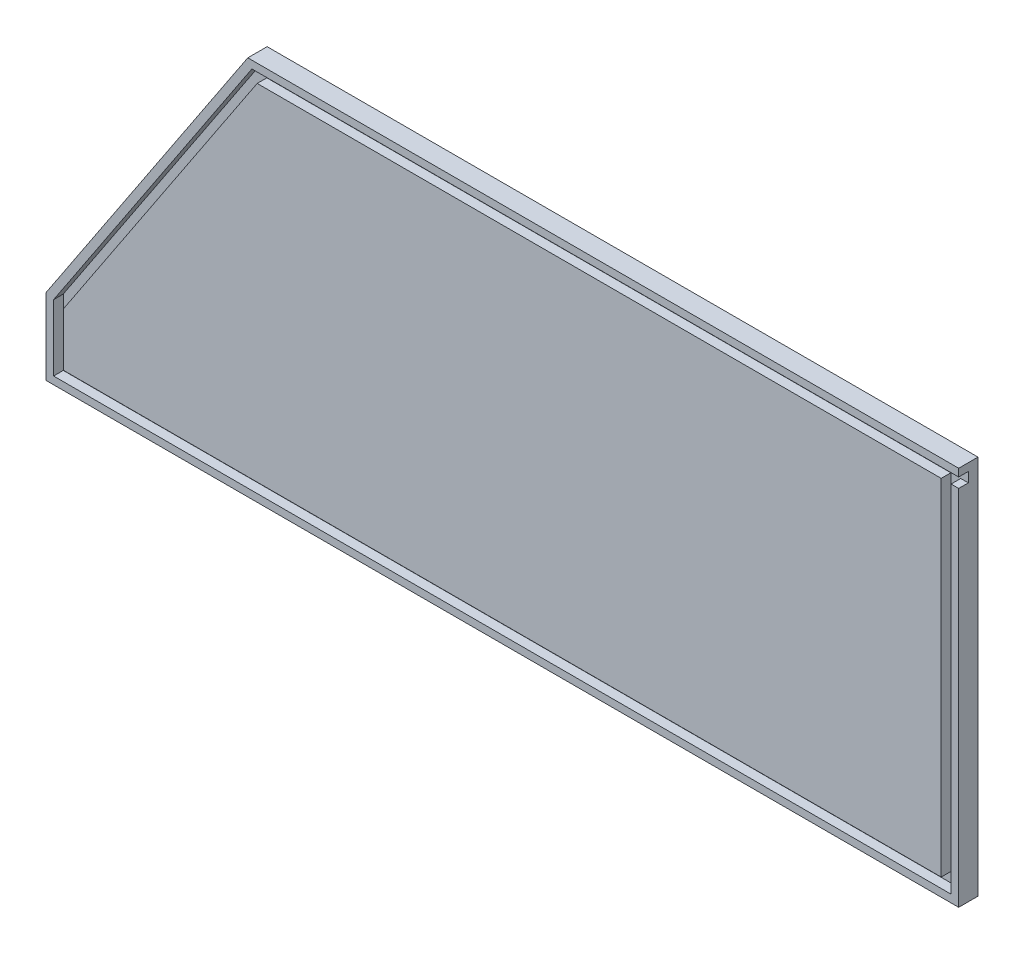
ISO-10303-21;
HEADER;
FILE_DESCRIPTION(('STEP AP214'),'2;1');
FILE_NAME('part.step','',(''),(''),'','','');
FILE_SCHEMA(('AUTOMOTIVE_DESIGN { 1 0 10303 214 1 1 1 1 }'));
ENDSEC;
DATA;
#1=APPLICATION_CONTEXT('core data for automotive mechanical design processes');
#2=APPLICATION_PROTOCOL_DEFINITION('international standard','automotive_design',2000,#1);
#3=PRODUCT_CONTEXT('',#1,'mechanical');
#4=PRODUCT('Part','Part','',(#3));
#5=PRODUCT_RELATED_PRODUCT_CATEGORY('part','',(#4));
#6=PRODUCT_DEFINITION_FORMATION('','',#4);
#7=PRODUCT_DEFINITION_CONTEXT('part definition',#1,'design');
#8=PRODUCT_DEFINITION('design','',#6,#7);
#9=PRODUCT_DEFINITION_SHAPE('','',#8);
#10=(LENGTH_UNIT() NAMED_UNIT(*) SI_UNIT(.MILLI.,.METRE.));
#11=(NAMED_UNIT(*) PLANE_ANGLE_UNIT() SI_UNIT($,.RADIAN.));
#12=(NAMED_UNIT(*) SI_UNIT($,.STERADIAN.) SOLID_ANGLE_UNIT());
#13=UNCERTAINTY_MEASURE_WITH_UNIT(LENGTH_MEASURE(1.E-05),#10,'distance_accuracy_value','');
#14=(GEOMETRIC_REPRESENTATION_CONTEXT(3) GLOBAL_UNCERTAINTY_ASSIGNED_CONTEXT((#13)) GLOBAL_UNIT_ASSIGNED_CONTEXT((#10,
#11,#12)) REPRESENTATION_CONTEXT('',''));
#15=CARTESIAN_POINT('',(0.,0.,0.));
#16=DIRECTION('',(0.,0.,1.));
#17=DIRECTION('',(1.,0.,0.));
#18=AXIS2_PLACEMENT_3D('',#15,#16,#17);
#19=CARTESIAN_POINT('',(-524.529885057471,24.3080459770115,12.7));
#20=DIRECTION('',(1.,0.,0.));
#21=DIRECTION('',(0.,0.,-1.));
#22=AXIS2_PLACEMENT_3D('',#19,#20,#21);
#23=PLANE('',#22);
#24=DIRECTION('',(0.,-1.,0.));
#25=VECTOR('',#24,1.);
#26=CARTESIAN_POINT('',(-524.529885057471,24.3080459770115,0.));
#27=LINE('',#26,#25);
#28=CARTESIAN_POINT('',(-524.529885057471,24.3080459770115,0.));
#29=VERTEX_POINT('',#28);
#30=CARTESIAN_POINT('',(-524.529885057471,-25.6919540229885,0.));
#31=VERTEX_POINT('',#30);
#32=EDGE_CURVE('E245',#29,#31,#27,.T.);
#33=ORIENTED_EDGE('',*,*,#32,.T.);
#34=DIRECTION('',(0.,0.,-1.));
#35=VECTOR('',#34,1.);
#36=CARTESIAN_POINT('',(-524.529885057471,-25.6919540229885,12.7));
#37=LINE('',#36,#35);
#38=CARTESIAN_POINT('',(-524.529885057471,-25.6919540229885,12.7));
#39=VERTEX_POINT('',#38);
#40=EDGE_CURVE('E11',#39,#31,#37,.T.);
#41=ORIENTED_EDGE('',*,*,#40,.F.);
#42=DIRECTION('',(0.,-1.,0.));
#43=VECTOR('',#42,1.);
#44=CARTESIAN_POINT('',(-524.529885057471,24.3080459770115,12.7));
#45=LINE('',#44,#43);
#46=CARTESIAN_POINT('',(-524.529885057471,24.3080459770115,12.7));
#47=VERTEX_POINT('',#46);
#48=EDGE_CURVE('E251',#47,#39,#45,.T.);
#49=ORIENTED_EDGE('',*,*,#48,.F.);
#50=DIRECTION('',(0.,0.,-1.));
#51=VECTOR('',#50,1.);
#52=CARTESIAN_POINT('',(-524.529885057471,24.3080459770115,12.7));
#53=LINE('',#52,#51);
#54=EDGE_CURVE('E264',#47,#29,#53,.T.);
#55=ORIENTED_EDGE('',*,*,#54,.T.);
#56=EDGE_LOOP('',(#33,#41,#49,#55));
#57=FACE_BOUND('',#56,.T.);
#58=ADVANCED_FACE('F32',(#57),#23,.F.);
#59=CARTESIAN_POINT('',(-524.529885057471,-25.6919540229885,12.7));
#60=DIRECTION('',(0.,1.,0.));
#61=DIRECTION('',(0.,0.,1.));
#62=AXIS2_PLACEMENT_3D('',#59,#60,#61);
#63=PLANE('',#62);
#64=DIRECTION('',(1.,0.,0.));
#65=VECTOR('',#64,1.);
#66=CARTESIAN_POINT('',(-524.529885057471,-25.6919540229885,0.));
#67=LINE('',#66,#65);
#68=CARTESIAN_POINT('',(75.4701149425288,-25.6919540229885,0.));
#69=VERTEX_POINT('',#68);
#70=EDGE_CURVE('E267',#31,#69,#67,.T.);
#71=ORIENTED_EDGE('',*,*,#70,.T.);
#72=DIRECTION('',(0.,0.,-1.));
#73=VECTOR('',#72,1.);
#74=CARTESIAN_POINT('',(75.4701149425288,-25.6919540229885,12.7));
#75=LINE('',#74,#73);
#76=CARTESIAN_POINT('',(75.4701149425288,-25.6919540229885,12.7));
#77=VERTEX_POINT('',#76);
#78=EDGE_CURVE('E39',#77,#69,#75,.T.);
#79=ORIENTED_EDGE('',*,*,#78,.F.);
#80=DIRECTION('',(1.,0.,0.));
#81=VECTOR('',#80,1.);
#82=CARTESIAN_POINT('',(-524.529885057471,-25.6919540229885,12.7));
#83=LINE('',#82,#81);
#84=EDGE_CURVE('E254',#39,#77,#83,.T.);
#85=ORIENTED_EDGE('',*,*,#84,.F.);
#86=ORIENTED_EDGE('',*,*,#40,.T.);
#87=EDGE_LOOP('',(#71,#79,#85,#86));
#88=FACE_BOUND('',#87,.T.);
#89=ADVANCED_FACE('F320',(#88),#63,.F.);
#90=CARTESIAN_POINT('',(75.4701149425288,-25.6919540229885,12.7));
#91=DIRECTION('',(-1.,0.,0.));
#92=DIRECTION('',(0.,0.,1.));
#93=AXIS2_PLACEMENT_3D('',#90,#91,#92);
#94=PLANE('',#93);
#95=DIRECTION('',(0.,1.,0.));
#96=VECTOR('',#95,1.);
#97=CARTESIAN_POINT('',(75.4701149425288,-25.6919540229885,12.7));
#98=LINE('',#97,#96);
#99=CARTESIAN_POINT('',(75.4701149425288,219.308045977011,12.7));
#100=VERTEX_POINT('',#99);
#101=CARTESIAN_POINT('',(75.4701149425288,224.308045977011,12.7));
#102=VERTEX_POINT('',#101);
#103=EDGE_CURVE('E257',#100,#102,#98,.T.);
#104=ORIENTED_EDGE('',*,*,#103,.F.);
#105=DIRECTION('',(0.,0.,-1.));
#106=VECTOR('',#105,1.);
#107=CARTESIAN_POINT('',(75.4701149425288,219.308045977011,12.7));
#108=LINE('',#107,#106);
#109=CARTESIAN_POINT('',(75.4701149425288,219.308045977011,6.35));
#110=VERTEX_POINT('',#109);
#111=EDGE_CURVE('E177',#100,#110,#108,.T.);
#112=ORIENTED_EDGE('',*,*,#111,.T.);
#113=DIRECTION('',(0.,1.,0.));
#114=VECTOR('',#113,1.);
#115=CARTESIAN_POINT('',(75.4701149425288,-25.6919540229885,6.35));
#116=LINE('',#115,#114);
#117=CARTESIAN_POINT('',(75.4701149425288,212.808045977011,6.35));
#118=VERTEX_POINT('',#117);
#119=EDGE_CURVE('E162',#118,#110,#116,.T.);
#120=ORIENTED_EDGE('',*,*,#119,.F.);
#121=DIRECTION('',(0.,0.,1.));
#122=VECTOR('',#121,1.);
#123=CARTESIAN_POINT('',(75.4701149425288,212.808045977011,12.7));
#124=LINE('',#123,#122);
#125=CARTESIAN_POINT('',(75.4701149425288,212.808045977011,12.7));
#126=VERTEX_POINT('',#125);
#127=EDGE_CURVE('E151',#118,#126,#124,.T.);
#128=ORIENTED_EDGE('',*,*,#127,.T.);
#129=EDGE_CURVE('E258',#77,#126,#98,.T.);
#130=ORIENTED_EDGE('',*,*,#129,.F.);
#131=ORIENTED_EDGE('',*,*,#78,.T.);
#132=DIRECTION('',(0.,1.,0.));
#133=VECTOR('',#132,1.);
#134=CARTESIAN_POINT('',(75.4701149425288,-25.6919540229885,0.));
#135=LINE('',#134,#133);
#136=CARTESIAN_POINT('',(75.4701149425288,224.308045977011,0.));
#137=VERTEX_POINT('',#136);
#138=EDGE_CURVE('E269',#69,#137,#135,.T.);
#139=ORIENTED_EDGE('',*,*,#138,.T.);
#140=DIRECTION('',(0.,0.,-1.));
#141=VECTOR('',#140,1.);
#142=CARTESIAN_POINT('',(75.4701149425288,224.308045977011,12.7));
#143=LINE('',#142,#141);
#144=EDGE_CURVE('E279',#102,#137,#143,.T.);
#145=ORIENTED_EDGE('',*,*,#144,.F.);
#146=EDGE_LOOP('',(#104,#112,#120,#128,#130,#131,#139,#145));
#147=FACE_BOUND('',#146,.T.);
#148=ADVANCED_FACE('F175',(#147),#94,.F.);
#149=CARTESIAN_POINT('',(75.4701149425288,224.308045977011,12.7));
#150=DIRECTION('',(0.,-1.,0.));
#151=DIRECTION('',(1.,0.,0.));
#152=AXIS2_PLACEMENT_3D('',#149,#150,#151);
#153=PLANE('',#152);
#154=DIRECTION('',(-1.,0.,0.));
#155=VECTOR('',#154,1.);
#156=CARTESIAN_POINT('',(75.4701149425288,224.308045977011,0.));
#157=LINE('',#156,#155);
#158=CARTESIAN_POINT('',(-391.864893443255,224.308045977011,0.));
#159=VERTEX_POINT('',#158);
#160=EDGE_CURVE('E271',#137,#159,#157,.T.);
#161=ORIENTED_EDGE('',*,*,#160,.T.);
#162=DIRECTION('',(0.,0.,-1.));
#163=VECTOR('',#162,1.);
#164=CARTESIAN_POINT('',(-391.864893443255,224.308045977011,12.7));
#165=LINE('',#164,#163);
#166=CARTESIAN_POINT('',(-391.864893443255,224.308045977011,12.7));
#167=VERTEX_POINT('',#166);
#168=EDGE_CURVE('E276',#167,#159,#165,.T.);
#169=ORIENTED_EDGE('',*,*,#168,.F.);
#170=DIRECTION('',(-1.,0.,0.));
#171=VECTOR('',#170,1.);
#172=CARTESIAN_POINT('',(75.4701149425288,224.308045977011,12.7));
#173=LINE('',#172,#171);
#174=EDGE_CURVE('E260',#102,#167,#173,.T.);
#175=ORIENTED_EDGE('',*,*,#174,.F.);
#176=ORIENTED_EDGE('',*,*,#144,.T.);
#177=EDGE_LOOP('',(#161,#169,#175,#176));
#178=FACE_BOUND('',#177,.T.);
#179=ADVANCED_FACE('F293',(#178),#153,.F.);
#180=CARTESIAN_POINT('',(-391.864893443255,224.308045977011,12.7));
#181=DIRECTION('',(0.833333333333333,-0.552770798392567,0.));
#182=DIRECTION('',(0.552770798392567,0.833333333333333,0.));
#183=AXIS2_PLACEMENT_3D('',#180,#181,#182);
#184=PLANE('',#183);
#185=DIRECTION('',(-0.552770798392567,-0.833333333333333,0.));
#186=VECTOR('',#185,1.);
#187=CARTESIAN_POINT('',(-391.864893443255,224.308045977011,0.));
#188=LINE('',#187,#186);
#189=EDGE_CURVE('E255',#159,#29,#188,.T.);
#190=ORIENTED_EDGE('',*,*,#189,.T.);
#191=ORIENTED_EDGE('',*,*,#54,.F.);
#192=DIRECTION('',(-0.552770798392567,-0.833333333333333,0.));
#193=VECTOR('',#192,1.);
#194=CARTESIAN_POINT('',(-391.864893443255,224.308045977011,12.7));
#195=LINE('',#194,#193);
#196=EDGE_CURVE('E262',#167,#47,#195,.T.);
#197=ORIENTED_EDGE('',*,*,#196,.F.);
#198=ORIENTED_EDGE('',*,*,#168,.T.);
#199=EDGE_LOOP('',(#190,#191,#197,#198));
#200=FACE_BOUND('',#199,.T.);
#201=ADVANCED_FACE('F297',(#200),#184,.F.);
#202=CARTESIAN_POINT('',(0.,0.,12.7));
#203=DIRECTION('',(0.,0.,1.));
#204=DIRECTION('',(1.,0.,0.));
#205=AXIS2_PLACEMENT_3D('',#202,#203,#204);
#206=PLANE('',#205);
#207=DIRECTION('',(-1.,0.,0.));
#208=VECTOR('',#207,1.);
#209=CARTESIAN_POINT('',(70.4701149425288,219.308045977011,12.7));
#210=LINE('',#209,#208);
#211=CARTESIAN_POINT('',(-389.181518233611,219.308045977011,12.7));
#212=VERTEX_POINT('',#211);
#213=EDGE_CURVE('E223',#100,#212,#210,.T.);
#214=ORIENTED_EDGE('',*,*,#213,.F.);
#215=ORIENTED_EDGE('',*,*,#103,.T.);
#216=ORIENTED_EDGE('',*,*,#174,.T.);
#217=ORIENTED_EDGE('',*,*,#196,.T.);
#218=ORIENTED_EDGE('',*,*,#48,.T.);
#219=ORIENTED_EDGE('',*,*,#84,.T.);
#220=ORIENTED_EDGE('',*,*,#129,.T.);
#221=DIRECTION('',(1.,0.,0.));
#222=VECTOR('',#221,1.);
#223=CARTESIAN_POINT('',(44.6269003916069,212.808045977011,12.7));
#224=LINE('',#223,#222);
#225=CARTESIAN_POINT('',(70.4701149425288,212.808045977011,12.7));
#226=VERTEX_POINT('',#225);
#227=EDGE_CURVE('E157',#226,#126,#224,.T.);
#228=ORIENTED_EDGE('',*,*,#227,.F.);
#229=DIRECTION('',(0.,1.,0.));
#230=VECTOR('',#229,1.);
#231=CARTESIAN_POINT('',(70.4701149425288,-20.6919540229885,12.7));
#232=LINE('',#231,#230);
#233=CARTESIAN_POINT('',(70.4701149425288,-20.6919540229885,12.7));
#234=VERTEX_POINT('',#233);
#235=EDGE_CURVE('E239',#234,#226,#232,.T.);
#236=ORIENTED_EDGE('',*,*,#235,.F.);
#237=DIRECTION('',(1.,0.,0.));
#238=VECTOR('',#237,1.);
#239=CARTESIAN_POINT('',(-519.529885057471,-20.6919540229885,12.7));
#240=LINE('',#239,#238);
#241=CARTESIAN_POINT('',(-519.529885057471,-20.6919540229885,12.7));
#242=VERTEX_POINT('',#241);
#243=EDGE_CURVE('E236',#242,#234,#240,.T.);
#244=ORIENTED_EDGE('',*,*,#243,.F.);
#245=DIRECTION('',(0.,-1.,0.));
#246=VECTOR('',#245,1.);
#247=CARTESIAN_POINT('',(-519.529885057471,22.8004892541227,12.7));
#248=LINE('',#247,#246);
#249=CARTESIAN_POINT('',(-519.529885057471,22.8004892541227,12.7));
#250=VERTEX_POINT('',#249);
#251=EDGE_CURVE('E233',#250,#242,#248,.T.);
#252=ORIENTED_EDGE('',*,*,#251,.F.);
#253=DIRECTION('',(-0.552770798392567,-0.833333333333333,0.));
#254=VECTOR('',#253,1.);
#255=CARTESIAN_POINT('',(-389.181518233611,219.308045977011,12.7));
#256=LINE('',#255,#254);
#257=EDGE_CURVE('E46',#212,#250,#256,.T.);
#258=ORIENTED_EDGE('',*,*,#257,.F.);
#259=EDGE_LOOP('',(#214,#215,#216,#217,#218,#219,#220,#228,#236,#244,#252,#258));
#260=FACE_BOUND('',#259,.T.);
#261=ADVANCED_FACE('F301',(#260),#206,.T.);
#262=CARTESIAN_POINT('',(0.,0.,0.));
#263=DIRECTION('',(0.,0.,1.));
#264=DIRECTION('',(1.,0.,0.));
#265=AXIS2_PLACEMENT_3D('',#262,#263,#264);
#266=PLANE('',#265);
#267=ORIENTED_EDGE('',*,*,#32,.F.);
#268=ORIENTED_EDGE('',*,*,#189,.F.);
#269=ORIENTED_EDGE('',*,*,#160,.F.);
#270=ORIENTED_EDGE('',*,*,#138,.F.);
#271=ORIENTED_EDGE('',*,*,#70,.F.);
#272=EDGE_LOOP('',(#267,#268,#269,#270,#271));
#273=FACE_BOUND('',#272,.T.);
#274=ADVANCED_FACE('F289',(#273),#266,.F.);
#275=CARTESIAN_POINT('',(-389.181518233611,219.308045977011,6.35));
#276=DIRECTION('',(-0.833333333333333,0.552770798392567,0.));
#277=DIRECTION('',(-0.552770798392567,-0.833333333333333,0.));
#278=AXIS2_PLACEMENT_3D('',#275,#276,#277);
#279=PLANE('',#278);
#280=ORIENTED_EDGE('',*,*,#257,.T.);
#281=DIRECTION('',(0.,0.,1.));
#282=VECTOR('',#281,1.);
#283=CARTESIAN_POINT('',(-519.529885057471,22.8004892541227,6.35));
#284=LINE('',#283,#282);
#285=CARTESIAN_POINT('',(-519.529885057471,22.8004892541227,6.35));
#286=VERTEX_POINT('',#285);
#287=EDGE_CURVE('E231',#286,#250,#284,.T.);
#288=ORIENTED_EDGE('',*,*,#287,.F.);
#289=DIRECTION('',(-0.552770798392567,-0.833333333333333,0.));
#290=VECTOR('',#289,1.);
#291=CARTESIAN_POINT('',(-389.181518233611,219.308045977011,6.35));
#292=LINE('',#291,#290);
#293=CARTESIAN_POINT('',(-389.181518233611,219.308045977011,6.35));
#294=VERTEX_POINT('',#293);
#295=EDGE_CURVE('E219',#294,#286,#292,.T.);
#296=ORIENTED_EDGE('',*,*,#295,.F.);
#297=DIRECTION('',(0.,0.,1.));
#298=VECTOR('',#297,1.);
#299=CARTESIAN_POINT('',(-389.181518233611,219.308045977011,6.35));
#300=LINE('',#299,#298);
#301=EDGE_CURVE('E243',#294,#212,#300,.T.);
#302=ORIENTED_EDGE('',*,*,#301,.T.);
#303=EDGE_LOOP('',(#280,#288,#296,#302));
#304=FACE_BOUND('',#303,.T.);
#305=ADVANCED_FACE('F309',(#304),#279,.F.);
#306=CARTESIAN_POINT('',(70.4701149425288,219.308045977011,6.35));
#307=DIRECTION('',(0.,1.,0.));
#308=DIRECTION('',(-1.,0.,0.));
#309=AXIS2_PLACEMENT_3D('',#306,#307,#308);
#310=PLANE('',#309);
#311=ORIENTED_EDGE('',*,*,#301,.F.);
#312=DIRECTION('',(-1.,0.,0.));
#313=VECTOR('',#312,1.);
#314=CARTESIAN_POINT('',(70.4701149425288,219.308045977011,6.35));
#315=LINE('',#314,#313);
#316=EDGE_CURVE('E229',#110,#294,#315,.T.);
#317=ORIENTED_EDGE('',*,*,#316,.F.);
#318=ORIENTED_EDGE('',*,*,#111,.F.);
#319=ORIENTED_EDGE('',*,*,#213,.T.);
#320=EDGE_LOOP('',(#311,#317,#318,#319));
#321=FACE_BOUND('',#320,.T.);
#322=ADVANCED_FACE('F306',(#321),#310,.F.);
#323=CARTESIAN_POINT('',(70.4701149425288,-20.6919540229885,6.35));
#324=DIRECTION('',(1.,0.,0.));
#325=DIRECTION('',(0.,0.,-1.));
#326=AXIS2_PLACEMENT_3D('',#323,#324,#325);
#327=PLANE('',#326);
#328=ORIENTED_EDGE('',*,*,#235,.T.);
#329=DIRECTION('',(0.,0.,-1.));
#330=VECTOR('',#329,1.);
#331=CARTESIAN_POINT('',(70.4701149425288,212.808045977011,6.35));
#332=LINE('',#331,#330);
#333=CARTESIAN_POINT('',(70.4701149425288,212.808045977011,6.35));
#334=VERTEX_POINT('',#333);
#335=EDGE_CURVE('E163',#226,#334,#332,.T.);
#336=ORIENTED_EDGE('',*,*,#335,.T.);
#337=DIRECTION('',(0.,1.,0.));
#338=VECTOR('',#337,1.);
#339=CARTESIAN_POINT('',(70.4701149425288,-20.6919540229885,6.35));
#340=LINE('',#339,#338);
#341=CARTESIAN_POINT('',(70.4701149425288,-20.6919540229885,6.35));
#342=VERTEX_POINT('',#341);
#343=EDGE_CURVE('E172',#342,#334,#340,.T.);
#344=ORIENTED_EDGE('',*,*,#343,.F.);
#345=DIRECTION('',(0.,0.,1.));
#346=VECTOR('',#345,1.);
#347=CARTESIAN_POINT('',(70.4701149425288,-20.6919540229885,6.35));
#348=LINE('',#347,#346);
#349=EDGE_CURVE('E246',#342,#234,#348,.T.);
#350=ORIENTED_EDGE('',*,*,#349,.T.);
#351=EDGE_LOOP('',(#328,#336,#344,#350));
#352=FACE_BOUND('',#351,.T.);
#353=ADVANCED_FACE('F318',(#352),#327,.F.);
#354=CARTESIAN_POINT('',(-519.529885057471,-20.6919540229885,6.35));
#355=DIRECTION('',(0.,-1.,0.));
#356=DIRECTION('',(0.,0.,-1.));
#357=AXIS2_PLACEMENT_3D('',#354,#355,#356);
#358=PLANE('',#357);
#359=ORIENTED_EDGE('',*,*,#243,.T.);
#360=ORIENTED_EDGE('',*,*,#349,.F.);
#361=DIRECTION('',(1.,0.,0.));
#362=VECTOR('',#361,1.);
#363=CARTESIAN_POINT('',(-519.529885057471,-20.6919540229885,6.35));
#364=LINE('',#363,#362);
#365=CARTESIAN_POINT('',(-519.529885057471,-20.6919540229885,6.35));
#366=VERTEX_POINT('',#365);
#367=EDGE_CURVE('E226',#366,#342,#364,.T.);
#368=ORIENTED_EDGE('',*,*,#367,.F.);
#369=DIRECTION('',(0.,0.,1.));
#370=VECTOR('',#369,1.);
#371=CARTESIAN_POINT('',(-519.529885057471,-20.6919540229885,6.35));
#372=LINE('',#371,#370);
#373=EDGE_CURVE('E248',#366,#242,#372,.T.);
#374=ORIENTED_EDGE('',*,*,#373,.T.);
#375=EDGE_LOOP('',(#359,#360,#368,#374));
#376=FACE_BOUND('',#375,.T.);
#377=ADVANCED_FACE('F315',(#376),#358,.F.);
#378=CARTESIAN_POINT('',(-519.529885057471,22.8004892541227,6.35));
#379=DIRECTION('',(-1.,0.,0.));
#380=DIRECTION('',(0.,0.,1.));
#381=AXIS2_PLACEMENT_3D('',#378,#379,#380);
#382=PLANE('',#381);
#383=ORIENTED_EDGE('',*,*,#251,.T.);
#384=ORIENTED_EDGE('',*,*,#373,.F.);
#385=DIRECTION('',(0.,-1.,0.));
#386=VECTOR('',#385,1.);
#387=CARTESIAN_POINT('',(-519.529885057471,22.8004892541227,6.35));
#388=LINE('',#387,#386);
#389=EDGE_CURVE('E222',#286,#366,#388,.T.);
#390=ORIENTED_EDGE('',*,*,#389,.F.);
#391=ORIENTED_EDGE('',*,*,#287,.T.);
#392=EDGE_LOOP('',(#383,#384,#390,#391));
#393=FACE_BOUND('',#392,.T.);
#394=ADVANCED_FACE('F311',(#393),#382,.F.);
#395=CARTESIAN_POINT('',(0.,0.,6.35));
#396=DIRECTION('',(0.,0.,1.));
#397=DIRECTION('',(1.,0.,0.));
#398=AXIS2_PLACEMENT_3D('',#395,#396,#397);
#399=PLANE('',#398);
#400=DIRECTION('',(-0.552770798392567,-0.833333333333333,0.));
#401=VECTOR('',#400,1.);
#402=CARTESIAN_POINT('',(-385.693130461073,212.808045977011,6.35));
#403=LINE('',#402,#401);
#404=CARTESIAN_POINT('',(-385.693130461073,212.808045977011,6.35));
#405=VERTEX_POINT('',#404);
#406=CARTESIAN_POINT('',(-513.029885057471,20.8406655143671,6.35));
#407=VERTEX_POINT('',#406);
#408=EDGE_CURVE('E183',#405,#407,#403,.T.);
#409=ORIENTED_EDGE('',*,*,#408,.F.);
#410=DIRECTION('',(-1.,0.,0.));
#411=VECTOR('',#410,1.);
#412=CARTESIAN_POINT('',(63.9701149425287,212.808045977011,6.35));
#413=LINE('',#412,#411);
#414=CARTESIAN_POINT('',(63.9701149425287,212.808045977011,6.35));
#415=VERTEX_POINT('',#414);
#416=EDGE_CURVE('E196',#415,#405,#413,.T.);
#417=ORIENTED_EDGE('',*,*,#416,.F.);
#418=DIRECTION('',(0.,1.,0.));
#419=VECTOR('',#418,1.);
#420=CARTESIAN_POINT('',(63.9701149425287,-14.1919540229885,6.35));
#421=LINE('',#420,#419);
#422=CARTESIAN_POINT('',(63.9701149425287,-14.1919540229885,6.35));
#423=VERTEX_POINT('',#422);
#424=EDGE_CURVE('E193',#423,#415,#421,.T.);
#425=ORIENTED_EDGE('',*,*,#424,.F.);
#426=DIRECTION('',(1.,0.,0.));
#427=VECTOR('',#426,1.);
#428=CARTESIAN_POINT('',(-513.029885057471,-14.1919540229885,6.35));
#429=LINE('',#428,#427);
#430=CARTESIAN_POINT('',(-513.029885057471,-14.1919540229885,6.35));
#431=VERTEX_POINT('',#430);
#432=EDGE_CURVE('E190',#431,#423,#429,.T.);
#433=ORIENTED_EDGE('',*,*,#432,.F.);
#434=DIRECTION('',(0.,-1.,0.));
#435=VECTOR('',#434,1.);
#436=CARTESIAN_POINT('',(-513.029885057471,20.8406655143671,6.35));
#437=LINE('',#436,#435);
#438=EDGE_CURVE('E186',#407,#431,#437,.T.);
#439=ORIENTED_EDGE('',*,*,#438,.F.);
#440=EDGE_LOOP('',(#409,#417,#425,#433,#439));
#441=FACE_BOUND('',#440,.T.);
#442=ORIENTED_EDGE('',*,*,#316,.T.);
#443=ORIENTED_EDGE('',*,*,#295,.T.);
#444=ORIENTED_EDGE('',*,*,#389,.T.);
#445=ORIENTED_EDGE('',*,*,#367,.T.);
#446=ORIENTED_EDGE('',*,*,#343,.T.);
#447=DIRECTION('',(-1.,0.,0.));
#448=VECTOR('',#447,1.);
#449=CARTESIAN_POINT('',(44.6269003916069,212.808045977011,6.35));
#450=LINE('',#449,#448);
#451=EDGE_CURVE('E154',#118,#334,#450,.T.);
#452=ORIENTED_EDGE('',*,*,#451,.F.);
#453=ORIENTED_EDGE('',*,*,#119,.T.);
#454=EDGE_LOOP('',(#442,#443,#444,#445,#446,#452,#453));
#455=FACE_BOUND('',#454,.T.);
#456=ADVANCED_FACE('F168',(#441,#455),#399,.T.);
#457=CARTESIAN_POINT('',(-385.693130461073,212.808045977011,6.35));
#458=DIRECTION('',(-0.833333333333333,0.552770798392567,0.));
#459=DIRECTION('',(-0.552770798392567,-0.833333333333333,0.));
#460=AXIS2_PLACEMENT_3D('',#457,#458,#459);
#461=PLANE('',#460);
#462=DIRECTION('',(-0.552770798392567,-0.833333333333333,0.));
#463=VECTOR('',#462,1.);
#464=CARTESIAN_POINT('',(-385.693130461073,212.808045977011,12.7));
#465=LINE('',#464,#463);
#466=CARTESIAN_POINT('',(-385.693130461073,212.808045977011,12.7));
#467=VERTEX_POINT('',#466);
#468=CARTESIAN_POINT('',(-513.029885057471,20.8406655143671,12.7));
#469=VERTEX_POINT('',#468);
#470=EDGE_CURVE('E179',#467,#469,#465,.T.);
#471=ORIENTED_EDGE('',*,*,#470,.F.);
#472=DIRECTION('',(0.,0.,1.));
#473=VECTOR('',#472,1.);
#474=CARTESIAN_POINT('',(-385.693130461073,212.808045977011,6.35));
#475=LINE('',#474,#473);
#476=EDGE_CURVE('E209',#405,#467,#475,.T.);
#477=ORIENTED_EDGE('',*,*,#476,.F.);
#478=ORIENTED_EDGE('',*,*,#408,.T.);
#479=DIRECTION('',(0.,0.,1.));
#480=VECTOR('',#479,1.);
#481=CARTESIAN_POINT('',(-513.029885057471,20.8406655143671,6.35));
#482=LINE('',#481,#480);
#483=EDGE_CURVE('E198',#407,#469,#482,.T.);
#484=ORIENTED_EDGE('',*,*,#483,.T.);
#485=EDGE_LOOP('',(#471,#477,#478,#484));
#486=FACE_BOUND('',#485,.T.);
#487=ADVANCED_FACE('F352',(#486),#461,.T.);
#488=CARTESIAN_POINT('',(63.9701149425287,212.808045977011,6.35));
#489=DIRECTION('',(0.,1.,0.));
#490=DIRECTION('',(-1.,0.,0.));
#491=AXIS2_PLACEMENT_3D('',#488,#489,#490);
#492=PLANE('',#491);
#493=ORIENTED_EDGE('',*,*,#476,.T.);
#494=DIRECTION('',(-1.,0.,0.));
#495=VECTOR('',#494,1.);
#496=CARTESIAN_POINT('',(63.9701149425287,212.808045977011,12.7));
#497=LINE('',#496,#495);
#498=CARTESIAN_POINT('',(63.9701149425287,212.808045977011,12.7));
#499=VERTEX_POINT('',#498);
#500=EDGE_CURVE('E187',#499,#467,#497,.T.);
#501=ORIENTED_EDGE('',*,*,#500,.F.);
#502=DIRECTION('',(0.,0.,1.));
#503=VECTOR('',#502,1.);
#504=CARTESIAN_POINT('',(63.9701149425287,212.808045977011,6.35));
#505=LINE('',#504,#503);
#506=EDGE_CURVE('E212',#415,#499,#505,.T.);
#507=ORIENTED_EDGE('',*,*,#506,.F.);
#508=ORIENTED_EDGE('',*,*,#416,.T.);
#509=EDGE_LOOP('',(#493,#501,#507,#508));
#510=FACE_BOUND('',#509,.T.);
#511=ADVANCED_FACE('F356',(#510),#492,.T.);
#512=CARTESIAN_POINT('',(63.9701149425287,-14.1919540229885,6.35));
#513=DIRECTION('',(1.,0.,0.));
#514=DIRECTION('',(0.,0.,-1.));
#515=AXIS2_PLACEMENT_3D('',#512,#513,#514);
#516=PLANE('',#515);
#517=DIRECTION('',(0.,1.,0.));
#518=VECTOR('',#517,1.);
#519=CARTESIAN_POINT('',(63.9701149425287,-14.1919540229885,12.7));
#520=LINE('',#519,#518);
#521=CARTESIAN_POINT('',(63.9701149425287,-14.1919540229885,12.7));
#522=VERTEX_POINT('',#521);
#523=EDGE_CURVE('E205',#522,#499,#520,.T.);
#524=ORIENTED_EDGE('',*,*,#523,.F.);
#525=DIRECTION('',(0.,0.,1.));
#526=VECTOR('',#525,1.);
#527=CARTESIAN_POINT('',(63.9701149425287,-14.1919540229885,6.35));
#528=LINE('',#527,#526);
#529=EDGE_CURVE('E214',#423,#522,#528,.T.);
#530=ORIENTED_EDGE('',*,*,#529,.F.);
#531=ORIENTED_EDGE('',*,*,#424,.T.);
#532=ORIENTED_EDGE('',*,*,#506,.T.);
#533=EDGE_LOOP('',(#524,#530,#531,#532));
#534=FACE_BOUND('',#533,.T.);
#535=ADVANCED_FACE('F365',(#534),#516,.T.);
#536=CARTESIAN_POINT('',(-513.029885057471,-14.1919540229885,6.35));
#537=DIRECTION('',(0.,-1.,0.));
#538=DIRECTION('',(1.,0.,0.));
#539=AXIS2_PLACEMENT_3D('',#536,#537,#538);
#540=PLANE('',#539);
#541=DIRECTION('',(1.,0.,0.));
#542=VECTOR('',#541,1.);
#543=CARTESIAN_POINT('',(-513.029885057471,-14.1919540229885,12.7));
#544=LINE('',#543,#542);
#545=CARTESIAN_POINT('',(-513.029885057471,-14.1919540229885,12.7));
#546=VERTEX_POINT('',#545);
#547=EDGE_CURVE('E54',#546,#522,#544,.T.);
#548=ORIENTED_EDGE('',*,*,#547,.F.);
#549=DIRECTION('',(0.,0.,1.));
#550=VECTOR('',#549,1.);
#551=CARTESIAN_POINT('',(-513.029885057471,-14.1919540229885,6.35));
#552=LINE('',#551,#550);
#553=EDGE_CURVE('E216',#431,#546,#552,.T.);
#554=ORIENTED_EDGE('',*,*,#553,.F.);
#555=ORIENTED_EDGE('',*,*,#432,.T.);
#556=ORIENTED_EDGE('',*,*,#529,.T.);
#557=EDGE_LOOP('',(#548,#554,#555,#556));
#558=FACE_BOUND('',#557,.T.);
#559=ADVANCED_FACE('F361',(#558),#540,.T.);
#560=CARTESIAN_POINT('',(-513.029885057471,20.8406655143671,6.35));
#561=DIRECTION('',(-1.,0.,0.));
#562=DIRECTION('',(0.,0.,1.));
#563=AXIS2_PLACEMENT_3D('',#560,#561,#562);
#564=PLANE('',#563);
#565=DIRECTION('',(0.,-1.,0.));
#566=VECTOR('',#565,1.);
#567=CARTESIAN_POINT('',(-513.029885057471,20.8406655143671,12.7));
#568=LINE('',#567,#566);
#569=EDGE_CURVE('E201',#469,#546,#568,.T.);
#570=ORIENTED_EDGE('',*,*,#569,.F.);
#571=ORIENTED_EDGE('',*,*,#483,.F.);
#572=ORIENTED_EDGE('',*,*,#438,.T.);
#573=ORIENTED_EDGE('',*,*,#553,.T.);
#574=EDGE_LOOP('',(#570,#571,#572,#573));
#575=FACE_BOUND('',#574,.T.);
#576=ADVANCED_FACE('F358',(#575),#564,.T.);
#577=ORIENTED_EDGE('',*,*,#500,.T.);
#578=ORIENTED_EDGE('',*,*,#470,.T.);
#579=ORIENTED_EDGE('',*,*,#569,.T.);
#580=ORIENTED_EDGE('',*,*,#547,.T.);
#581=ORIENTED_EDGE('',*,*,#523,.T.);
#582=EDGE_LOOP('',(#577,#578,#579,#580,#581));
#583=FACE_BOUND('',#582,.T.);
#584=ADVANCED_FACE('F339',(#583),#206,.T.);
#585=CARTESIAN_POINT('',(44.6269003916069,212.808045977011,-35.6423542329027));
#586=DIRECTION('',(0.,-1.,0.));
#587=DIRECTION('',(0.,0.,-1.));
#588=AXIS2_PLACEMENT_3D('',#585,#586,#587);
#589=PLANE('',#588);
#590=ORIENTED_EDGE('',*,*,#451,.T.);
#591=ORIENTED_EDGE('',*,*,#335,.F.);
#592=ORIENTED_EDGE('',*,*,#227,.T.);
#593=ORIENTED_EDGE('',*,*,#127,.F.);
#594=EDGE_LOOP('',(#590,#591,#592,#593));
#595=FACE_BOUND('',#594,.T.);
#596=ADVANCED_FACE('F153',(#595),#589,.F.);
#597=CLOSED_SHELL('',(#58,#89,#148,#179,#201,#261,#274,#305,#322,#353,#377,#394,#456,#487,#511,
#535,#559,#576,#584,#596));
#598=MANIFOLD_SOLID_BREP('B2',#597);
#599=ADVANCED_BREP_SHAPE_REPRESENTATION('',(#18,#598),#14);
#600=SHAPE_DEFINITION_REPRESENTATION(#9,#599);
ENDSEC;
END-ISO-10303-21;
